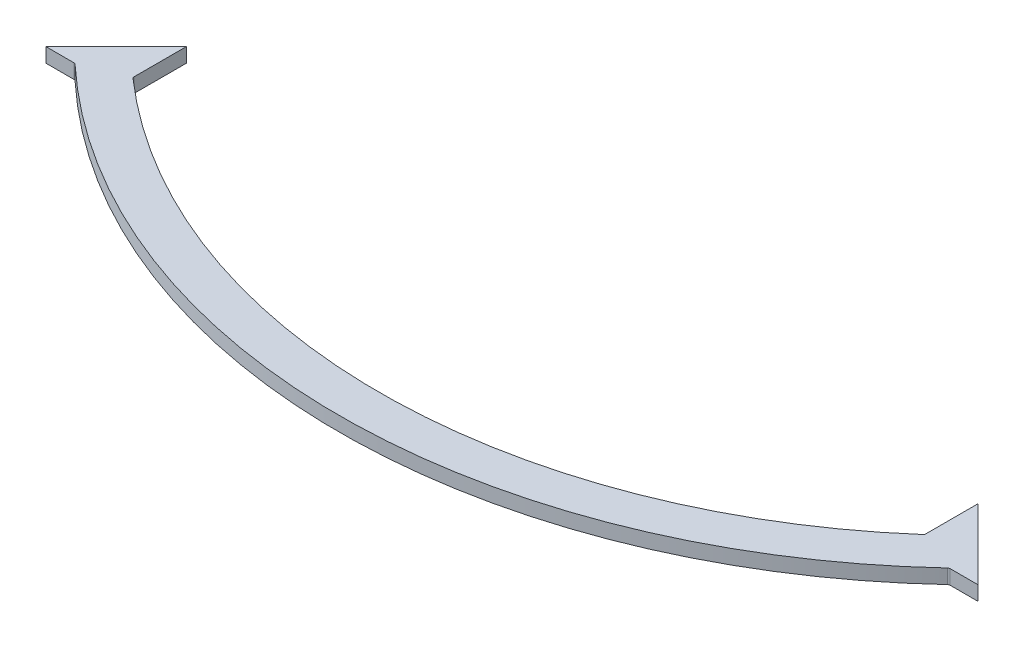
ISO-10303-21;
HEADER;
FILE_DESCRIPTION(('STEP AP214'),'2;1');
FILE_NAME('part.step','',(''),(''),'','','');
FILE_SCHEMA(('AUTOMOTIVE_DESIGN { 1 0 10303 214 1 1 1 1 }'));
ENDSEC;
DATA;
#1=APPLICATION_CONTEXT('core data for automotive mechanical design processes');
#2=APPLICATION_PROTOCOL_DEFINITION('international standard','automotive_design',2000,#1);
#3=PRODUCT_CONTEXT('',#1,'mechanical');
#4=PRODUCT('Part','Part','',(#3));
#5=PRODUCT_RELATED_PRODUCT_CATEGORY('part','',(#4));
#6=PRODUCT_DEFINITION_FORMATION('','',#4);
#7=PRODUCT_DEFINITION_CONTEXT('part definition',#1,'design');
#8=PRODUCT_DEFINITION('design','',#6,#7);
#9=PRODUCT_DEFINITION_SHAPE('','',#8);
#10=(LENGTH_UNIT() NAMED_UNIT(*) SI_UNIT(.MILLI.,.METRE.));
#11=(NAMED_UNIT(*) PLANE_ANGLE_UNIT() SI_UNIT($,.RADIAN.));
#12=(NAMED_UNIT(*) SI_UNIT($,.STERADIAN.) SOLID_ANGLE_UNIT());
#13=UNCERTAINTY_MEASURE_WITH_UNIT(LENGTH_MEASURE(1.E-05),#10,'distance_accuracy_value','');
#14=(GEOMETRIC_REPRESENTATION_CONTEXT(3) GLOBAL_UNCERTAINTY_ASSIGNED_CONTEXT((#13)) GLOBAL_UNIT_ASSIGNED_CONTEXT((#10,
#11,#12)) REPRESENTATION_CONTEXT('',''));
#15=CARTESIAN_POINT('',(0.,0.,0.));
#16=DIRECTION('',(0.,0.,1.));
#17=DIRECTION('',(1.,0.,0.));
#18=AXIS2_PLACEMENT_3D('',#15,#16,#17);
#19=CARTESIAN_POINT('',(-501.650000000002,18.25625,501.649999999998));
#20=DIRECTION('',(-1.,0.,0.));
#21=DIRECTION('',(0.,0.,1.));
#22=AXIS2_PLACEMENT_3D('',#19,#20,#21);
#23=PLANE('',#22);
#24=DIRECTION('',(0.,0.,-1.));
#25=VECTOR('',#24,1.);
#26=CARTESIAN_POINT('',(-501.650000000002,18.25625,501.649999999998));
#27=LINE('',#26,#25);
#28=CARTESIAN_POINT('',(-501.650000000002,18.25625,567.824868207617));
#29=VERTEX_POINT('',#28);
#30=CARTESIAN_POINT('',(-501.650000000002,18.25625,501.649999999998));
#31=VERTEX_POINT('',#30);
#32=EDGE_CURVE('E162',#29,#31,#27,.T.);
#33=ORIENTED_EDGE('',*,*,#32,.F.);
#34=DIRECTION('',(0.,1.,0.));
#35=VECTOR('',#34,1.);
#36=CARTESIAN_POINT('',(-501.650000000002,0.,567.824868207617));
#37=LINE('',#36,#35);
#38=CARTESIAN_POINT('',(-501.650000000002,0.,567.824868207617));
#39=VERTEX_POINT('',#38);
#40=EDGE_CURVE('E170',#29,#39,#37,.F.);
#41=ORIENTED_EDGE('',*,*,#40,.T.);
#42=DIRECTION('',(0.,0.,-1.));
#43=VECTOR('',#42,1.);
#44=CARTESIAN_POINT('',(-501.650000000002,0.,501.649999999998));
#45=LINE('',#44,#43);
#46=CARTESIAN_POINT('',(-501.650000000002,0.,501.649999999998));
#47=VERTEX_POINT('',#46);
#48=EDGE_CURVE('E131',#39,#47,#45,.T.);
#49=ORIENTED_EDGE('',*,*,#48,.T.);
#50=DIRECTION('',(0.,-1.,0.));
#51=VECTOR('',#50,1.);
#52=CARTESIAN_POINT('',(-501.650000000002,18.25625,501.649999999998));
#53=LINE('',#52,#51);
#54=EDGE_CURVE('E127',#31,#47,#53,.T.);
#55=ORIENTED_EDGE('',*,*,#54,.F.);
#56=EDGE_LOOP('',(#33,#41,#49,#55));
#57=FACE_BOUND('',#56,.T.);
#58=ADVANCED_FACE('F32',(#57),#23,.F.);
#59=CARTESIAN_POINT('',(-590.550000000002,18.25625,590.549999999998));
#60=DIRECTION('',(0.,0.,-1.));
#61=DIRECTION('',(-1.,0.,0.));
#62=AXIS2_PLACEMENT_3D('',#59,#60,#61);
#63=PLANE('',#62);
#64=DIRECTION('',(1.,0.,0.));
#65=VECTOR('',#64,1.);
#66=CARTESIAN_POINT('',(-590.550000000002,0.,590.549999999998));
#67=LINE('',#66,#65);
#68=CARTESIAN_POINT('',(-590.550000000002,0.,590.549999999998));
#69=VERTEX_POINT('',#68);
#70=CARTESIAN_POINT('',(-555.178796834857,0.,590.55));
#71=VERTEX_POINT('',#70);
#72=EDGE_CURVE('E138',#69,#71,#67,.T.);
#73=ORIENTED_EDGE('',*,*,#72,.T.);
#74=DIRECTION('',(0.,1.,0.));
#75=VECTOR('',#74,1.);
#76=CARTESIAN_POINT('',(-555.178796834857,18.25625,590.55));
#77=LINE('',#76,#75);
#78=CARTESIAN_POINT('',(-555.178796834857,18.25625,590.55));
#79=VERTEX_POINT('',#78);
#80=EDGE_CURVE('E183',#71,#79,#77,.T.);
#81=ORIENTED_EDGE('',*,*,#80,.T.);
#82=DIRECTION('',(1.,0.,0.));
#83=VECTOR('',#82,1.);
#84=CARTESIAN_POINT('',(-590.550000000002,18.25625,590.549999999998));
#85=LINE('',#84,#83);
#86=CARTESIAN_POINT('',(-590.550000000002,18.25625,590.549999999998));
#87=VERTEX_POINT('',#86);
#88=EDGE_CURVE('E141',#87,#79,#85,.T.);
#89=ORIENTED_EDGE('',*,*,#88,.F.);
#90=DIRECTION('',(0.,-1.,0.));
#91=VECTOR('',#90,1.);
#92=CARTESIAN_POINT('',(-590.550000000002,18.25625,590.549999999998));
#93=LINE('',#92,#91);
#94=EDGE_CURVE('E124',#87,#69,#93,.T.);
#95=ORIENTED_EDGE('',*,*,#94,.T.);
#96=EDGE_LOOP('',(#73,#81,#89,#95));
#97=FACE_BOUND('',#96,.T.);
#98=ADVANCED_FACE('F137',(#97),#63,.F.);
#99=CARTESIAN_POINT('',(0.,18.25625,0.));
#100=DIRECTION('',(0.,-1.,0.));
#101=DIRECTION('',(0.,0.,-1.));
#102=AXIS2_PLACEMENT_3D('',#99,#100,#101);
#103=CYLINDRICAL_SURFACE('',#102,809.625);
#104=CARTESIAN_POINT('',(0.,18.25625,0.));
#105=DIRECTION('',(0.,1.,0.));
#106=DIRECTION('',(0.,0.,1.));
#107=AXIS2_PLACEMENT_3D('',#104,#105,#106);
#108=CIRCLE('',#107,809.625);
#109=CARTESIAN_POINT('',(-552.871911681801,18.25625,591.460302893027));
#110=VERTEX_POINT('',#109);
#111=CARTESIAN_POINT('',(552.871911681801,18.25625,591.460302893027));
#112=VERTEX_POINT('',#111);
#113=EDGE_CURVE('E212',#110,#112,#108,.T.);
#114=ORIENTED_EDGE('',*,*,#113,.F.);
#115=DIRECTION('',(0.,-1.,0.));
#116=VECTOR('',#115,1.);
#117=CARTESIAN_POINT('',(-552.871911681801,18.25625,591.460302893027));
#118=LINE('',#117,#116);
#119=CARTESIAN_POINT('',(-552.871911681801,0.,591.460302893027));
#120=VERTEX_POINT('',#119);
#121=EDGE_CURVE('E180',#110,#120,#118,.T.);
#122=ORIENTED_EDGE('',*,*,#121,.T.);
#123=CARTESIAN_POINT('',(0.,0.,0.));
#124=DIRECTION('',(0.,1.,0.));
#125=DIRECTION('',(0.,0.,1.));
#126=AXIS2_PLACEMENT_3D('',#123,#124,#125);
#127=CIRCLE('',#126,809.625);
#128=CARTESIAN_POINT('',(552.871911681801,0.,591.460302893027));
#129=VERTEX_POINT('',#128);
#130=EDGE_CURVE('E147',#120,#129,#127,.T.);
#131=ORIENTED_EDGE('',*,*,#130,.T.);
#132=DIRECTION('',(0.,-1.,0.));
#133=VECTOR('',#132,1.);
#134=CARTESIAN_POINT('',(552.871911681801,18.25625,591.460302893027));
#135=LINE('',#134,#133);
#136=EDGE_CURVE('E178',#129,#112,#135,.F.);
#137=ORIENTED_EDGE('',*,*,#136,.T.);
#138=EDGE_LOOP('',(#114,#122,#131,#137));
#139=FACE_BOUND('',#138,.T.);
#140=ADVANCED_FACE('F203',(#139),#103,.T.);
#141=CARTESIAN_POINT('',(590.55,18.25625,590.55));
#142=DIRECTION('',(0.,0.,-1.));
#143=DIRECTION('',(-1.,0.,0.));
#144=AXIS2_PLACEMENT_3D('',#141,#142,#143);
#145=PLANE('',#144);
#146=DIRECTION('',(1.,0.,0.));
#147=VECTOR('',#146,1.);
#148=CARTESIAN_POINT('',(590.55,18.25625,590.55));
#149=LINE('',#148,#147);
#150=CARTESIAN_POINT('',(555.178796834858,18.25625,590.55));
#151=VERTEX_POINT('',#150);
#152=CARTESIAN_POINT('',(590.55,18.25625,590.55));
#153=VERTEX_POINT('',#152);
#154=EDGE_CURVE('E208',#151,#153,#149,.T.);
#155=ORIENTED_EDGE('',*,*,#154,.F.);
#156=DIRECTION('',(0.,1.,0.));
#157=VECTOR('',#156,1.);
#158=CARTESIAN_POINT('',(555.178796834858,0.,590.55));
#159=LINE('',#158,#157);
#160=CARTESIAN_POINT('',(555.178796834858,0.,590.55));
#161=VERTEX_POINT('',#160);
#162=EDGE_CURVE('E187',#151,#161,#159,.F.);
#163=ORIENTED_EDGE('',*,*,#162,.T.);
#164=DIRECTION('',(1.,0.,0.));
#165=VECTOR('',#164,1.);
#166=CARTESIAN_POINT('',(590.55,0.,590.55));
#167=LINE('',#166,#165);
#168=CARTESIAN_POINT('',(590.55,0.,590.55));
#169=VERTEX_POINT('',#168);
#170=EDGE_CURVE('E150',#161,#169,#167,.T.);
#171=ORIENTED_EDGE('',*,*,#170,.T.);
#172=DIRECTION('',(0.,-1.,0.));
#173=VECTOR('',#172,1.);
#174=CARTESIAN_POINT('',(590.55,18.25625,590.55));
#175=LINE('',#174,#173);
#176=EDGE_CURVE('E142',#153,#169,#175,.T.);
#177=ORIENTED_EDGE('',*,*,#176,.F.);
#178=EDGE_LOOP('',(#155,#163,#171,#177));
#179=FACE_BOUND('',#178,.T.);
#180=ADVANCED_FACE('F206',(#179),#145,.F.);
#181=CARTESIAN_POINT('',(501.65,18.25625,501.65));
#182=DIRECTION('',(1.,0.,0.));
#183=DIRECTION('',(0.,0.,-1.));
#184=AXIS2_PLACEMENT_3D('',#181,#182,#183);
#185=PLANE('',#184);
#186=DIRECTION('',(0.,0.,1.));
#187=VECTOR('',#186,1.);
#188=CARTESIAN_POINT('',(501.65,0.,501.65));
#189=LINE('',#188,#187);
#190=CARTESIAN_POINT('',(501.65,0.,501.65));
#191=VERTEX_POINT('',#190);
#192=CARTESIAN_POINT('',(501.65,0.,567.824868207619));
#193=VERTEX_POINT('',#192);
#194=EDGE_CURVE('E156',#191,#193,#189,.T.);
#195=ORIENTED_EDGE('',*,*,#194,.T.);
#196=DIRECTION('',(0.,1.,0.));
#197=VECTOR('',#196,1.);
#198=CARTESIAN_POINT('',(501.65,18.25625,567.824868207619));
#199=LINE('',#198,#197);
#200=CARTESIAN_POINT('',(501.65,18.25625,567.824868207619));
#201=VERTEX_POINT('',#200);
#202=EDGE_CURVE('E185',#193,#201,#199,.T.);
#203=ORIENTED_EDGE('',*,*,#202,.T.);
#204=DIRECTION('',(0.,0.,1.));
#205=VECTOR('',#204,1.);
#206=CARTESIAN_POINT('',(501.65,18.25625,501.65));
#207=LINE('',#206,#205);
#208=CARTESIAN_POINT('',(501.65,18.25625,501.65));
#209=VERTEX_POINT('',#208);
#210=EDGE_CURVE('E211',#209,#201,#207,.T.);
#211=ORIENTED_EDGE('',*,*,#210,.F.);
#212=DIRECTION('',(0.,-1.,0.));
#213=VECTOR('',#212,1.);
#214=CARTESIAN_POINT('',(501.65,18.25625,501.65));
#215=LINE('',#214,#213);
#216=EDGE_CURVE('E163',#209,#191,#215,.T.);
#217=ORIENTED_EDGE('',*,*,#216,.T.);
#218=EDGE_LOOP('',(#195,#203,#211,#217));
#219=FACE_BOUND('',#218,.T.);
#220=ADVANCED_FACE('F238',(#219),#185,.F.);
#221=CARTESIAN_POINT('',(0.,18.25625,0.));
#222=DIRECTION('',(0.,-1.,0.));
#223=DIRECTION('',(0.,0.,-1.));
#224=AXIS2_PLACEMENT_3D('',#221,#222,#223);
#225=CYLINDRICAL_SURFACE('',#224,758.825);
#226=CARTESIAN_POINT('',(0.,0.,0.));
#227=DIRECTION('',(0.,-1.,0.));
#228=DIRECTION('',(0.,0.,1.));
#229=AXIS2_PLACEMENT_3D('',#226,#227,#228);
#230=CIRCLE('',#229,758.825);
#231=CARTESIAN_POINT('',(500.499967218075,0.,570.364062191602));
#232=VERTEX_POINT('',#231);
#233=CARTESIAN_POINT('',(-500.499967218077,0.,570.3640621916));
#234=VERTEX_POINT('',#233);
#235=EDGE_CURVE('E159',#232,#234,#230,.T.);
#236=ORIENTED_EDGE('',*,*,#235,.T.);
#237=DIRECTION('',(0.,-1.,0.));
#238=VECTOR('',#237,1.);
#239=CARTESIAN_POINT('',(-500.499967218077,18.25625,570.3640621916));
#240=LINE('',#239,#238);
#241=CARTESIAN_POINT('',(-500.499967218077,18.25625,570.3640621916));
#242=VERTEX_POINT('',#241);
#243=EDGE_CURVE('E176',#234,#242,#240,.F.);
#244=ORIENTED_EDGE('',*,*,#243,.T.);
#245=CARTESIAN_POINT('',(0.,18.25625,0.));
#246=DIRECTION('',(0.,-1.,0.));
#247=DIRECTION('',(0.,0.,1.));
#248=AXIS2_PLACEMENT_3D('',#245,#246,#247);
#249=CIRCLE('',#248,758.825);
#250=CARTESIAN_POINT('',(500.499967218075,18.25625,570.364062191602));
#251=VERTEX_POINT('',#250);
#252=EDGE_CURVE('E166',#251,#242,#249,.T.);
#253=ORIENTED_EDGE('',*,*,#252,.F.);
#254=DIRECTION('',(0.,-1.,0.));
#255=VECTOR('',#254,1.);
#256=CARTESIAN_POINT('',(500.499967218075,18.25625,570.364062191602));
#257=LINE('',#256,#255);
#258=EDGE_CURVE('E173',#251,#232,#257,.T.);
#259=ORIENTED_EDGE('',*,*,#258,.T.);
#260=EDGE_LOOP('',(#236,#244,#253,#259));
#261=FACE_BOUND('',#260,.T.);
#262=ADVANCED_FACE('F232',(#261),#225,.F.);
#263=CARTESIAN_POINT('',(0.,18.25625,0.));
#264=DIRECTION('',(0.,1.,0.));
#265=DIRECTION('',(0.,0.,1.));
#266=AXIS2_PLACEMENT_3D('',#263,#264,#265);
#267=PLANE('',#266);
#268=DIRECTION('',(0.70710678118655,0.,-0.707106781186545));
#269=VECTOR('',#268,1.);
#270=CARTESIAN_POINT('',(-590.550000000002,18.25625,590.549999999998));
#271=LINE('',#270,#269);
#272=EDGE_CURVE('E132',#87,#31,#271,.T.);
#273=ORIENTED_EDGE('',*,*,#272,.F.);
#274=ORIENTED_EDGE('',*,*,#88,.T.);
#275=CARTESIAN_POINT('',(-555.178796834858,18.25625,593.9282));
#276=DIRECTION('',(0.,1.,0.));
#277=DIRECTION('',(0.,0.,1.));
#278=AXIS2_PLACEMENT_3D('',#275,#276,#277);
#279=CIRCLE('',#278,3.3782);
#280=EDGE_CURVE('E194',#79,#110,#279,.F.);
#281=ORIENTED_EDGE('',*,*,#280,.T.);
#282=ORIENTED_EDGE('',*,*,#113,.T.);
#283=CARTESIAN_POINT('',(555.178796834858,18.25625,593.9282));
#284=DIRECTION('',(0.,1.,0.));
#285=DIRECTION('',(0.,0.,1.));
#286=AXIS2_PLACEMENT_3D('',#283,#284,#285);
#287=CIRCLE('',#286,3.3782);
#288=EDGE_CURVE('E11',#112,#151,#287,.F.);
#289=ORIENTED_EDGE('',*,*,#288,.T.);
#290=ORIENTED_EDGE('',*,*,#154,.T.);
#291=DIRECTION('',(0.707106781186548,0.,0.707106781186548));
#292=VECTOR('',#291,1.);
#293=CARTESIAN_POINT('',(501.65,18.25625,501.65));
#294=LINE('',#293,#292);
#295=EDGE_CURVE('E242',#209,#153,#294,.T.);
#296=ORIENTED_EDGE('',*,*,#295,.F.);
#297=ORIENTED_EDGE('',*,*,#210,.T.);
#298=CARTESIAN_POINT('',(498.2718,18.25625,567.824868207619));
#299=DIRECTION('',(0.,1.,0.));
#300=DIRECTION('',(0.,0.,1.));
#301=AXIS2_PLACEMENT_3D('',#298,#299,#300);
#302=CIRCLE('',#301,3.3782);
#303=EDGE_CURVE('E198',#201,#251,#302,.F.);
#304=ORIENTED_EDGE('',*,*,#303,.T.);
#305=ORIENTED_EDGE('',*,*,#252,.T.);
#306=CARTESIAN_POINT('',(-498.271800000002,18.25625,567.824868207617));
#307=DIRECTION('',(0.,1.,0.));
#308=DIRECTION('',(0.,0.,1.));
#309=AXIS2_PLACEMENT_3D('',#306,#307,#308);
#310=CIRCLE('',#309,3.3782);
#311=EDGE_CURVE('E191',#242,#29,#310,.F.);
#312=ORIENTED_EDGE('',*,*,#311,.T.);
#313=ORIENTED_EDGE('',*,*,#32,.T.);
#314=EDGE_LOOP('',(#273,#274,#281,#282,#289,#290,#296,#297,#304,#305,#312,#313));
#315=FACE_BOUND('',#314,.T.);
#316=ADVANCED_FACE('F221',(#315),#267,.T.);
#317=CARTESIAN_POINT('',(0.,0.,0.));
#318=DIRECTION('',(0.,1.,0.));
#319=DIRECTION('',(0.,0.,1.));
#320=AXIS2_PLACEMENT_3D('',#317,#318,#319);
#321=PLANE('',#320);
#322=ORIENTED_EDGE('',*,*,#72,.F.);
#323=DIRECTION('',(0.70710678118655,0.,-0.707106781186545));
#324=VECTOR('',#323,1.);
#325=CARTESIAN_POINT('',(-590.550000000002,0.,590.549999999998));
#326=LINE('',#325,#324);
#327=EDGE_CURVE('E120',#69,#47,#326,.T.);
#328=ORIENTED_EDGE('',*,*,#327,.T.);
#329=ORIENTED_EDGE('',*,*,#48,.F.);
#330=CARTESIAN_POINT('',(-498.271800000002,0.,567.824868207617));
#331=DIRECTION('',(0.,1.,0.));
#332=DIRECTION('',(0.,0.,1.));
#333=AXIS2_PLACEMENT_3D('',#330,#331,#332);
#334=CIRCLE('',#333,3.3782);
#335=EDGE_CURVE('E189',#39,#234,#334,.T.);
#336=ORIENTED_EDGE('',*,*,#335,.T.);
#337=ORIENTED_EDGE('',*,*,#235,.F.);
#338=CARTESIAN_POINT('',(498.2718,0.,567.824868207619));
#339=DIRECTION('',(0.,1.,0.));
#340=DIRECTION('',(0.,0.,1.));
#341=AXIS2_PLACEMENT_3D('',#338,#339,#340);
#342=CIRCLE('',#341,3.3782);
#343=EDGE_CURVE('E196',#232,#193,#342,.T.);
#344=ORIENTED_EDGE('',*,*,#343,.T.);
#345=ORIENTED_EDGE('',*,*,#194,.F.);
#346=DIRECTION('',(0.707106781186548,0.,0.707106781186548));
#347=VECTOR('',#346,1.);
#348=CARTESIAN_POINT('',(501.65,0.,501.65));
#349=LINE('',#348,#347);
#350=EDGE_CURVE('E243',#191,#169,#349,.T.);
#351=ORIENTED_EDGE('',*,*,#350,.T.);
#352=ORIENTED_EDGE('',*,*,#170,.F.);
#353=CARTESIAN_POINT('',(555.178796834858,0.,593.9282));
#354=DIRECTION('',(0.,1.,0.));
#355=DIRECTION('',(0.,0.,1.));
#356=AXIS2_PLACEMENT_3D('',#353,#354,#355);
#357=CIRCLE('',#356,3.3782);
#358=EDGE_CURVE('E40',#161,#129,#357,.T.);
#359=ORIENTED_EDGE('',*,*,#358,.T.);
#360=ORIENTED_EDGE('',*,*,#130,.F.);
#361=CARTESIAN_POINT('',(-555.178796834858,0.,593.9282));
#362=DIRECTION('',(0.,1.,0.));
#363=DIRECTION('',(0.,0.,1.));
#364=AXIS2_PLACEMENT_3D('',#361,#362,#363);
#365=CIRCLE('',#364,3.3782);
#366=EDGE_CURVE('E146',#120,#71,#365,.T.);
#367=ORIENTED_EDGE('',*,*,#366,.T.);
#368=EDGE_LOOP('',(#322,#328,#329,#336,#337,#344,#345,#351,#352,#359,#360,#367));
#369=FACE_BOUND('',#368,.T.);
#370=ADVANCED_FACE('F144',(#369),#321,.F.);
#371=CARTESIAN_POINT('',(501.65,0.,501.65));
#372=DIRECTION('',(-0.707106781186548,0.,0.707106781186548));
#373=DIRECTION('',(0.707106781186548,0.,0.707106781186548));
#374=AXIS2_PLACEMENT_3D('',#371,#372,#373);
#375=PLANE('',#374);
#376=ORIENTED_EDGE('',*,*,#295,.T.);
#377=ORIENTED_EDGE('',*,*,#176,.T.);
#378=ORIENTED_EDGE('',*,*,#350,.F.);
#379=ORIENTED_EDGE('',*,*,#216,.F.);
#380=EDGE_LOOP('',(#376,#377,#378,#379));
#381=FACE_BOUND('',#380,.T.);
#382=ADVANCED_FACE('F241',(#381),#375,.F.);
#383=CARTESIAN_POINT('',(-590.550000000002,0.,590.549999999998));
#384=DIRECTION('',(0.707106781186545,0.,0.70710678118655));
#385=DIRECTION('',(0.70710678118655,0.,-0.707106781186545));
#386=AXIS2_PLACEMENT_3D('',#383,#384,#385);
#387=PLANE('',#386);
#388=ORIENTED_EDGE('',*,*,#272,.T.);
#389=ORIENTED_EDGE('',*,*,#54,.T.);
#390=ORIENTED_EDGE('',*,*,#327,.F.);
#391=ORIENTED_EDGE('',*,*,#94,.F.);
#392=EDGE_LOOP('',(#388,#389,#390,#391));
#393=FACE_BOUND('',#392,.T.);
#394=ADVANCED_FACE('F123',(#393),#387,.F.);
#395=CARTESIAN_POINT('',(-498.271800000002,18.25625,567.824868207617));
#396=DIRECTION('',(0.,-1.,0.));
#397=DIRECTION('',(0.,0.,-1.));
#398=AXIS2_PLACEMENT_3D('',#395,#396,#397);
#399=CYLINDRICAL_SURFACE('',#398,3.3782);
#400=ORIENTED_EDGE('',*,*,#311,.F.);
#401=ORIENTED_EDGE('',*,*,#243,.F.);
#402=ORIENTED_EDGE('',*,*,#335,.F.);
#403=ORIENTED_EDGE('',*,*,#40,.F.);
#404=EDGE_LOOP('',(#400,#401,#402,#403));
#405=FACE_BOUND('',#404,.T.);
#406=ADVANCED_FACE('F229',(#405),#399,.F.);
#407=CARTESIAN_POINT('',(-555.178796834858,18.25625,593.9282));
#408=DIRECTION('',(0.,-1.,0.));
#409=DIRECTION('',(0.,0.,-1.));
#410=AXIS2_PLACEMENT_3D('',#407,#408,#409);
#411=CYLINDRICAL_SURFACE('',#410,3.3782);
#412=ORIENTED_EDGE('',*,*,#280,.F.);
#413=ORIENTED_EDGE('',*,*,#80,.F.);
#414=ORIENTED_EDGE('',*,*,#366,.F.);
#415=ORIENTED_EDGE('',*,*,#121,.F.);
#416=EDGE_LOOP('',(#412,#413,#414,#415));
#417=FACE_BOUND('',#416,.T.);
#418=ADVANCED_FACE('F250',(#417),#411,.F.);
#419=CARTESIAN_POINT('',(498.2718,18.25625,567.824868207619));
#420=DIRECTION('',(0.,-1.,0.));
#421=DIRECTION('',(0.,0.,-1.));
#422=AXIS2_PLACEMENT_3D('',#419,#420,#421);
#423=CYLINDRICAL_SURFACE('',#422,3.3782);
#424=ORIENTED_EDGE('',*,*,#303,.F.);
#425=ORIENTED_EDGE('',*,*,#202,.F.);
#426=ORIENTED_EDGE('',*,*,#343,.F.);
#427=ORIENTED_EDGE('',*,*,#258,.F.);
#428=EDGE_LOOP('',(#424,#425,#426,#427));
#429=FACE_BOUND('',#428,.T.);
#430=ADVANCED_FACE('F234',(#429),#423,.F.);
#431=CARTESIAN_POINT('',(555.178796834858,18.25625,593.9282));
#432=DIRECTION('',(0.,-1.,0.));
#433=DIRECTION('',(0.,0.,-1.));
#434=AXIS2_PLACEMENT_3D('',#431,#432,#433);
#435=CYLINDRICAL_SURFACE('',#434,3.3782);
#436=ORIENTED_EDGE('',*,*,#288,.F.);
#437=ORIENTED_EDGE('',*,*,#136,.F.);
#438=ORIENTED_EDGE('',*,*,#358,.F.);
#439=ORIENTED_EDGE('',*,*,#162,.F.);
#440=EDGE_LOOP('',(#436,#437,#438,#439));
#441=FACE_BOUND('',#440,.T.);
#442=ADVANCED_FACE('F34',(#441),#435,.F.);
#443=CLOSED_SHELL('',(#58,#98,#140,#180,#220,#262,#316,#370,#382,#394,#406,#418,#430,#442));
#444=MANIFOLD_SOLID_BREP('B2',#443);
#445=ADVANCED_BREP_SHAPE_REPRESENTATION('',(#18,#444),#14);
#446=SHAPE_DEFINITION_REPRESENTATION(#9,#445);
ENDSEC;
END-ISO-10303-21;
